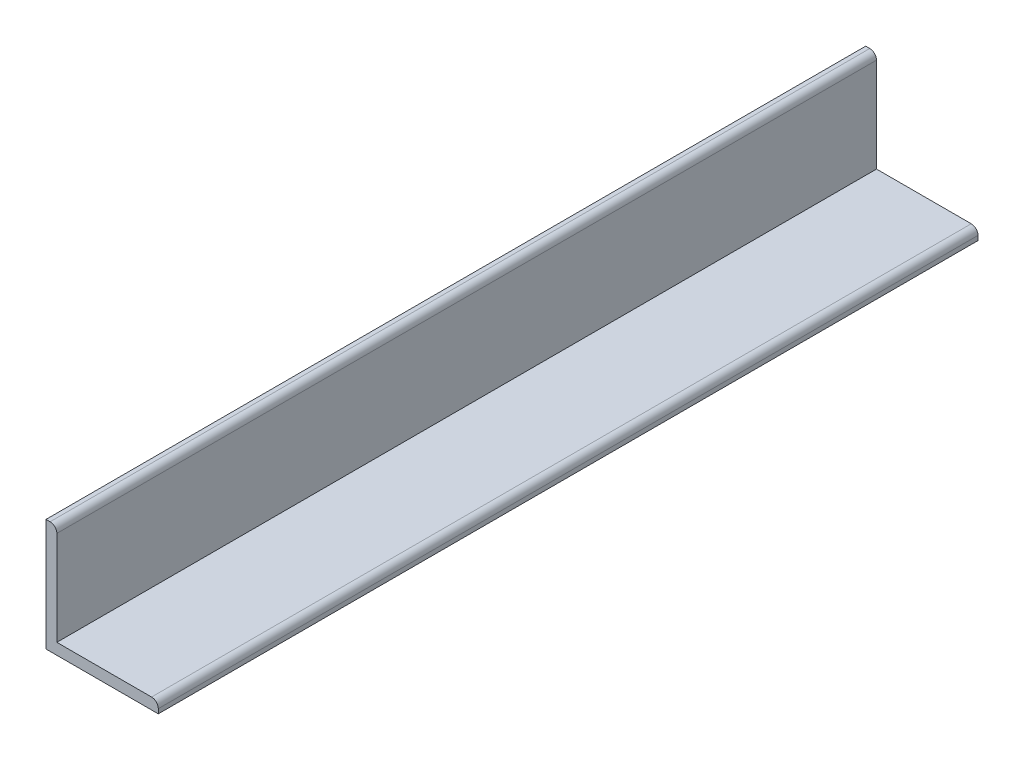
ISO-10303-21;
HEADER;
FILE_DESCRIPTION(('STEP AP214'),'2;1');
FILE_NAME('part.step','',(''),(''),'','','');
FILE_SCHEMA(('AUTOMOTIVE_DESIGN { 1 0 10303 214 1 1 1 1 }'));
ENDSEC;
DATA;
#1=APPLICATION_CONTEXT('core data for automotive mechanical design processes');
#2=APPLICATION_PROTOCOL_DEFINITION('international standard','automotive_design',2000,#1);
#3=PRODUCT_CONTEXT('',#1,'mechanical');
#4=PRODUCT('Part','Part','',(#3));
#5=PRODUCT_RELATED_PRODUCT_CATEGORY('part','',(#4));
#6=PRODUCT_DEFINITION_FORMATION('','',#4);
#7=PRODUCT_DEFINITION_CONTEXT('part definition',#1,'design');
#8=PRODUCT_DEFINITION('design','',#6,#7);
#9=PRODUCT_DEFINITION_SHAPE('','',#8);
#10=(LENGTH_UNIT() NAMED_UNIT(*) SI_UNIT(.MILLI.,.METRE.));
#11=(NAMED_UNIT(*) PLANE_ANGLE_UNIT() SI_UNIT($,.RADIAN.));
#12=(NAMED_UNIT(*) SI_UNIT($,.STERADIAN.) SOLID_ANGLE_UNIT());
#13=UNCERTAINTY_MEASURE_WITH_UNIT(LENGTH_MEASURE(1.E-05),#10,'distance_accuracy_value','');
#14=(GEOMETRIC_REPRESENTATION_CONTEXT(3) GLOBAL_UNCERTAINTY_ASSIGNED_CONTEXT((#13)) GLOBAL_UNIT_ASSIGNED_CONTEXT((#10,
#11,#12)) REPRESENTATION_CONTEXT('',''));
#15=CARTESIAN_POINT('',(0.,0.,0.));
#16=DIRECTION('',(0.,0.,1.));
#17=DIRECTION('',(1.,0.,0.));
#18=AXIS2_PLACEMENT_3D('',#15,#16,#17);
#19=CARTESIAN_POINT('',(-24.5463898281274,-25.4536101718726,182.5));
#20=DIRECTION('',(1.,0.,0.));
#21=DIRECTION('',(0.,0.,-1.));
#22=AXIS2_PLACEMENT_3D('',#19,#20,#21);
#23=PLANE('',#22);
#24=DIRECTION('',(0.,-1.,0.));
#25=VECTOR('',#24,1.);
#26=CARTESIAN_POINT('',(-24.5463898281274,-25.4536101718726,-182.5));
#27=LINE('',#26,#25);
#28=CARTESIAN_POINT('',(-24.5463898281274,24.5463898281274,-182.5));
#29=VERTEX_POINT('',#28);
#30=CARTESIAN_POINT('',(-24.5463898281274,-25.4536101718726,-182.5));
#31=VERTEX_POINT('',#30);
#32=EDGE_CURVE('E131',#29,#31,#27,.T.);
#33=ORIENTED_EDGE('',*,*,#32,.T.);
#34=DIRECTION('',(0.,0.,-1.));
#35=VECTOR('',#34,1.);
#36=CARTESIAN_POINT('',(-24.5463898281274,-25.4536101718726,182.5));
#37=LINE('',#36,#35);
#38=CARTESIAN_POINT('',(-24.5463898281274,-25.4536101718726,182.5));
#39=VERTEX_POINT('',#38);
#40=EDGE_CURVE('E11',#39,#31,#37,.T.);
#41=ORIENTED_EDGE('',*,*,#40,.F.);
#42=DIRECTION('',(0.,-1.,0.));
#43=VECTOR('',#42,1.);
#44=CARTESIAN_POINT('',(-24.5463898281274,-25.4536101718726,182.5));
#45=LINE('',#44,#43);
#46=CARTESIAN_POINT('',(-24.5463898281274,24.5463898281274,182.5));
#47=VERTEX_POINT('',#46);
#48=EDGE_CURVE('E145',#47,#39,#45,.T.);
#49=ORIENTED_EDGE('',*,*,#48,.F.);
#50=DIRECTION('',(0.,0.,-1.));
#51=VECTOR('',#50,1.);
#52=CARTESIAN_POINT('',(-24.5463898281274,24.5463898281274,182.5));
#53=LINE('',#52,#51);
#54=EDGE_CURVE('E127',#47,#29,#53,.T.);
#55=ORIENTED_EDGE('',*,*,#54,.T.);
#56=EDGE_LOOP('',(#33,#41,#49,#55));
#57=FACE_BOUND('',#56,.T.);
#58=ADVANCED_FACE('F35',(#57),#23,.F.);
#59=CARTESIAN_POINT('',(-24.5463898281274,-25.4536101718726,182.5));
#60=DIRECTION('',(0.,1.,0.));
#61=DIRECTION('',(0.,0.,1.));
#62=AXIS2_PLACEMENT_3D('',#59,#60,#61);
#63=PLANE('',#62);
#64=DIRECTION('',(1.,0.,0.));
#65=VECTOR('',#64,1.);
#66=CARTESIAN_POINT('',(-24.5463898281274,-25.4536101718726,-182.5));
#67=LINE('',#66,#65);
#68=CARTESIAN_POINT('',(25.4536101718726,-25.4536101718726,-182.5));
#69=VERTEX_POINT('',#68);
#70=EDGE_CURVE('E134',#31,#69,#67,.T.);
#71=ORIENTED_EDGE('',*,*,#70,.T.);
#72=DIRECTION('',(0.,0.,-1.));
#73=VECTOR('',#72,1.);
#74=CARTESIAN_POINT('',(25.4536101718726,-25.4536101718726,182.5));
#75=LINE('',#74,#73);
#76=CARTESIAN_POINT('',(25.4536101718726,-25.4536101718726,182.5));
#77=VERTEX_POINT('',#76);
#78=EDGE_CURVE('E43',#77,#69,#75,.T.);
#79=ORIENTED_EDGE('',*,*,#78,.F.);
#80=DIRECTION('',(1.,0.,0.));
#81=VECTOR('',#80,1.);
#82=CARTESIAN_POINT('',(-24.5463898281274,-25.4536101718726,182.5));
#83=LINE('',#82,#81);
#84=EDGE_CURVE('E94',#39,#77,#83,.T.);
#85=ORIENTED_EDGE('',*,*,#84,.F.);
#86=ORIENTED_EDGE('',*,*,#40,.T.);
#87=EDGE_LOOP('',(#71,#79,#85,#86));
#88=FACE_BOUND('',#87,.T.);
#89=ADVANCED_FACE('F180',(#88),#63,.F.);
#90=CARTESIAN_POINT('',(25.4536101718726,-25.4536101718726,182.5));
#91=DIRECTION('',(-1.,0.,0.));
#92=DIRECTION('',(0.,-1.,0.));
#93=AXIS2_PLACEMENT_3D('',#90,#91,#92);
#94=PLANE('',#93);
#95=DIRECTION('',(0.,1.,0.));
#96=VECTOR('',#95,1.);
#97=CARTESIAN_POINT('',(25.4536101718726,-25.4536101718726,-182.5));
#98=LINE('',#97,#96);
#99=CARTESIAN_POINT('',(25.4536101718726,-23.4536101718726,-182.5));
#100=VERTEX_POINT('',#99);
#101=EDGE_CURVE('E136',#69,#100,#98,.T.);
#102=ORIENTED_EDGE('',*,*,#101,.T.);
#103=DIRECTION('',(0.,0.,-1.));
#104=VECTOR('',#103,1.);
#105=CARTESIAN_POINT('',(25.4536101718726,-23.4536101718726,182.5));
#106=LINE('',#105,#104);
#107=CARTESIAN_POINT('',(25.4536101718726,-23.4536101718726,182.5));
#108=VERTEX_POINT('',#107);
#109=EDGE_CURVE('E152',#108,#100,#106,.T.);
#110=ORIENTED_EDGE('',*,*,#109,.F.);
#111=DIRECTION('',(0.,1.,0.));
#112=VECTOR('',#111,1.);
#113=CARTESIAN_POINT('',(25.4536101718726,-25.4536101718726,182.5));
#114=LINE('',#113,#112);
#115=EDGE_CURVE('E160',#77,#108,#114,.T.);
#116=ORIENTED_EDGE('',*,*,#115,.F.);
#117=ORIENTED_EDGE('',*,*,#78,.T.);
#118=EDGE_LOOP('',(#102,#110,#116,#117));
#119=FACE_BOUND('',#118,.T.);
#120=ADVANCED_FACE('F158',(#119),#94,.F.);
#121=CARTESIAN_POINT('',(22.4536101718726,-23.4536101718726,182.5));
#122=DIRECTION('',(0.,0.,-1.));
#123=DIRECTION('',(-1.,0.,0.));
#124=AXIS2_PLACEMENT_3D('',#121,#122,#123);
#125=CYLINDRICAL_SURFACE('',#124,3.);
#126=CARTESIAN_POINT('',(22.4536101718726,-23.4536101718726,-182.5));
#127=DIRECTION('',(0.,0.,1.));
#128=DIRECTION('',(-1.,0.,0.));
#129=AXIS2_PLACEMENT_3D('',#126,#127,#128);
#130=CIRCLE('',#129,3.);
#131=CARTESIAN_POINT('',(22.4536101718726,-20.4536101718726,-182.5));
#132=VERTEX_POINT('',#131);
#133=EDGE_CURVE('E138',#100,#132,#130,.T.);
#134=ORIENTED_EDGE('',*,*,#133,.T.);
#135=DIRECTION('',(0.,0.,-1.));
#136=VECTOR('',#135,1.);
#137=CARTESIAN_POINT('',(22.4536101718726,-20.4536101718726,182.5));
#138=LINE('',#137,#136);
#139=CARTESIAN_POINT('',(22.4536101718726,-20.4536101718726,182.5));
#140=VERTEX_POINT('',#139);
#141=EDGE_CURVE('E149',#140,#132,#138,.T.);
#142=ORIENTED_EDGE('',*,*,#141,.F.);
#143=CARTESIAN_POINT('',(22.4536101718726,-23.4536101718726,182.5));
#144=DIRECTION('',(0.,0.,1.));
#145=DIRECTION('',(-1.,0.,0.));
#146=AXIS2_PLACEMENT_3D('',#143,#144,#145);
#147=CIRCLE('',#146,3.);
#148=EDGE_CURVE('E172',#108,#140,#147,.T.);
#149=ORIENTED_EDGE('',*,*,#148,.F.);
#150=ORIENTED_EDGE('',*,*,#109,.T.);
#151=EDGE_LOOP('',(#134,#142,#149,#150));
#152=FACE_BOUND('',#151,.T.);
#153=ADVANCED_FACE('F168',(#152),#125,.T.);
#154=CARTESIAN_POINT('',(-19.7246003722544,-20.4536101718726,182.5));
#155=DIRECTION('',(0.,-1.,0.));
#156=DIRECTION('',(1.,0.,0.));
#157=AXIS2_PLACEMENT_3D('',#154,#155,#156);
#158=PLANE('',#157);
#159=DIRECTION('',(-1.,0.,0.));
#160=VECTOR('',#159,1.);
#161=CARTESIAN_POINT('',(-19.7246003722544,-20.4536101718726,-182.5));
#162=LINE('',#161,#160);
#163=CARTESIAN_POINT('',(-19.7246003722544,-20.4536101718726,-182.5));
#164=VERTEX_POINT('',#163);
#165=EDGE_CURVE('E140',#132,#164,#162,.T.);
#166=ORIENTED_EDGE('',*,*,#165,.T.);
#167=DIRECTION('',(0.,0.,-1.));
#168=VECTOR('',#167,1.);
#169=CARTESIAN_POINT('',(-19.7246003722544,-20.4536101718726,182.5));
#170=LINE('',#169,#168);
#171=CARTESIAN_POINT('',(-19.7246003722544,-20.4536101718726,182.5));
#172=VERTEX_POINT('',#171);
#173=EDGE_CURVE('E122',#172,#164,#170,.T.);
#174=ORIENTED_EDGE('',*,*,#173,.F.);
#175=DIRECTION('',(-1.,0.,0.));
#176=VECTOR('',#175,1.);
#177=CARTESIAN_POINT('',(-19.7246003722544,-20.4536101718726,182.5));
#178=LINE('',#177,#176);
#179=EDGE_CURVE('E113',#140,#172,#178,.T.);
#180=ORIENTED_EDGE('',*,*,#179,.F.);
#181=ORIENTED_EDGE('',*,*,#141,.T.);
#182=EDGE_LOOP('',(#166,#174,#180,#181));
#183=FACE_BOUND('',#182,.T.);
#184=ADVANCED_FACE('F171',(#183),#158,.F.);
#185=CARTESIAN_POINT('',(-19.7246003722544,21.5463898281274,182.5));
#186=DIRECTION('',(-1.,0.,0.));
#187=DIRECTION('',(0.,-1.,0.));
#188=AXIS2_PLACEMENT_3D('',#185,#186,#187);
#189=PLANE('',#188);
#190=DIRECTION('',(0.,1.,0.));
#191=VECTOR('',#190,1.);
#192=CARTESIAN_POINT('',(-19.7246003722544,21.5463898281274,-182.5));
#193=LINE('',#192,#191);
#194=CARTESIAN_POINT('',(-19.7246003722544,21.5463898281274,-182.5));
#195=VERTEX_POINT('',#194);
#196=EDGE_CURVE('E121',#164,#195,#193,.T.);
#197=ORIENTED_EDGE('',*,*,#196,.T.);
#198=DIRECTION('',(0.,0.,-1.));
#199=VECTOR('',#198,1.);
#200=CARTESIAN_POINT('',(-19.7246003722544,21.5463898281274,182.5));
#201=LINE('',#200,#199);
#202=CARTESIAN_POINT('',(-19.7246003722544,21.5463898281274,182.5));
#203=VERTEX_POINT('',#202);
#204=EDGE_CURVE('E118',#203,#195,#201,.T.);
#205=ORIENTED_EDGE('',*,*,#204,.F.);
#206=DIRECTION('',(0.,1.,0.));
#207=VECTOR('',#206,1.);
#208=CARTESIAN_POINT('',(-19.7246003722544,21.5463898281274,182.5));
#209=LINE('',#208,#207);
#210=EDGE_CURVE('E107',#172,#203,#209,.T.);
#211=ORIENTED_EDGE('',*,*,#210,.F.);
#212=ORIENTED_EDGE('',*,*,#173,.T.);
#213=EDGE_LOOP('',(#197,#205,#211,#212));
#214=FACE_BOUND('',#213,.T.);
#215=ADVANCED_FACE('F119',(#214),#189,.F.);
#216=CARTESIAN_POINT('',(-22.7246003722544,21.5463898281274,182.5));
#217=DIRECTION('',(0.,0.,-1.));
#218=DIRECTION('',(-1.,0.,0.));
#219=AXIS2_PLACEMENT_3D('',#216,#217,#218);
#220=CYLINDRICAL_SURFACE('',#219,3.);
#221=CARTESIAN_POINT('',(-22.7246003722544,21.5463898281274,-182.5));
#222=DIRECTION('',(0.,0.,1.));
#223=DIRECTION('',(1.,0.,0.));
#224=AXIS2_PLACEMENT_3D('',#221,#222,#223);
#225=CIRCLE('',#224,3.);
#226=CARTESIAN_POINT('',(-22.7246003722544,24.5463898281274,-182.5));
#227=VERTEX_POINT('',#226);
#228=EDGE_CURVE('E80',#195,#227,#225,.T.);
#229=ORIENTED_EDGE('',*,*,#228,.T.);
#230=DIRECTION('',(0.,0.,-1.));
#231=VECTOR('',#230,1.);
#232=CARTESIAN_POINT('',(-22.7246003722544,24.5463898281274,182.5));
#233=LINE('',#232,#231);
#234=CARTESIAN_POINT('',(-22.7246003722544,24.5463898281274,182.5));
#235=VERTEX_POINT('',#234);
#236=EDGE_CURVE('E123',#235,#227,#233,.T.);
#237=ORIENTED_EDGE('',*,*,#236,.F.);
#238=CARTESIAN_POINT('',(-22.7246003722544,21.5463898281274,182.5));
#239=DIRECTION('',(0.,0.,1.));
#240=DIRECTION('',(1.,0.,0.));
#241=AXIS2_PLACEMENT_3D('',#238,#239,#240);
#242=CIRCLE('',#241,3.);
#243=EDGE_CURVE('E111',#203,#235,#242,.T.);
#244=ORIENTED_EDGE('',*,*,#243,.F.);
#245=ORIENTED_EDGE('',*,*,#204,.T.);
#246=EDGE_LOOP('',(#229,#237,#244,#245));
#247=FACE_BOUND('',#246,.T.);
#248=ADVANCED_FACE('F125',(#247),#220,.T.);
#249=CARTESIAN_POINT('',(-24.5463898281274,24.5463898281274,182.5));
#250=DIRECTION('',(0.,-1.,0.));
#251=DIRECTION('',(0.,0.,-1.));
#252=AXIS2_PLACEMENT_3D('',#249,#250,#251);
#253=PLANE('',#252);
#254=DIRECTION('',(-1.,0.,0.));
#255=VECTOR('',#254,1.);
#256=CARTESIAN_POINT('',(-24.5463898281274,24.5463898281274,-182.5));
#257=LINE('',#256,#255);
#258=EDGE_CURVE('E86',#227,#29,#257,.T.);
#259=ORIENTED_EDGE('',*,*,#258,.T.);
#260=ORIENTED_EDGE('',*,*,#54,.F.);
#261=DIRECTION('',(-1.,0.,0.));
#262=VECTOR('',#261,1.);
#263=CARTESIAN_POINT('',(-24.5463898281274,24.5463898281274,182.5));
#264=LINE('',#263,#262);
#265=EDGE_CURVE('E51',#235,#47,#264,.T.);
#266=ORIENTED_EDGE('',*,*,#265,.F.);
#267=ORIENTED_EDGE('',*,*,#236,.T.);
#268=EDGE_LOOP('',(#259,#260,#266,#267));
#269=FACE_BOUND('',#268,.T.);
#270=ADVANCED_FACE('F196',(#269),#253,.F.);
#271=CARTESIAN_POINT('',(-22.7246003722544,21.5463898281274,182.5));
#272=DIRECTION('',(0.,0.,1.));
#273=DIRECTION('',(1.,0.,0.));
#274=AXIS2_PLACEMENT_3D('',#271,#272,#273);
#275=PLANE('',#274);
#276=ORIENTED_EDGE('',*,*,#48,.T.);
#277=ORIENTED_EDGE('',*,*,#84,.T.);
#278=ORIENTED_EDGE('',*,*,#115,.T.);
#279=ORIENTED_EDGE('',*,*,#148,.T.);
#280=ORIENTED_EDGE('',*,*,#179,.T.);
#281=ORIENTED_EDGE('',*,*,#210,.T.);
#282=ORIENTED_EDGE('',*,*,#243,.T.);
#283=ORIENTED_EDGE('',*,*,#265,.T.);
#284=EDGE_LOOP('',(#276,#277,#278,#279,#280,#281,#282,#283));
#285=FACE_BOUND('',#284,.T.);
#286=ADVANCED_FACE('F109',(#285),#275,.T.);
#287=CARTESIAN_POINT('',(-22.7246003722544,21.5463898281274,-182.5));
#288=DIRECTION('',(0.,0.,1.));
#289=DIRECTION('',(1.,0.,0.));
#290=AXIS2_PLACEMENT_3D('',#287,#288,#289);
#291=PLANE('',#290);
#292=ORIENTED_EDGE('',*,*,#32,.F.);
#293=ORIENTED_EDGE('',*,*,#258,.F.);
#294=ORIENTED_EDGE('',*,*,#228,.F.);
#295=ORIENTED_EDGE('',*,*,#196,.F.);
#296=ORIENTED_EDGE('',*,*,#165,.F.);
#297=ORIENTED_EDGE('',*,*,#133,.F.);
#298=ORIENTED_EDGE('',*,*,#101,.F.);
#299=ORIENTED_EDGE('',*,*,#70,.F.);
#300=EDGE_LOOP('',(#292,#293,#294,#295,#296,#297,#298,#299));
#301=FACE_BOUND('',#300,.T.);
#302=ADVANCED_FACE('F164',(#301),#291,.F.);
#303=CLOSED_SHELL('',(#58,#89,#120,#153,#184,#215,#248,#270,#286,#302));
#304=MANIFOLD_SOLID_BREP('B2',#303);
#305=ADVANCED_BREP_SHAPE_REPRESENTATION('',(#18,#304),#14);
#306=SHAPE_DEFINITION_REPRESENTATION(#9,#305);
ENDSEC;
END-ISO-10303-21;
